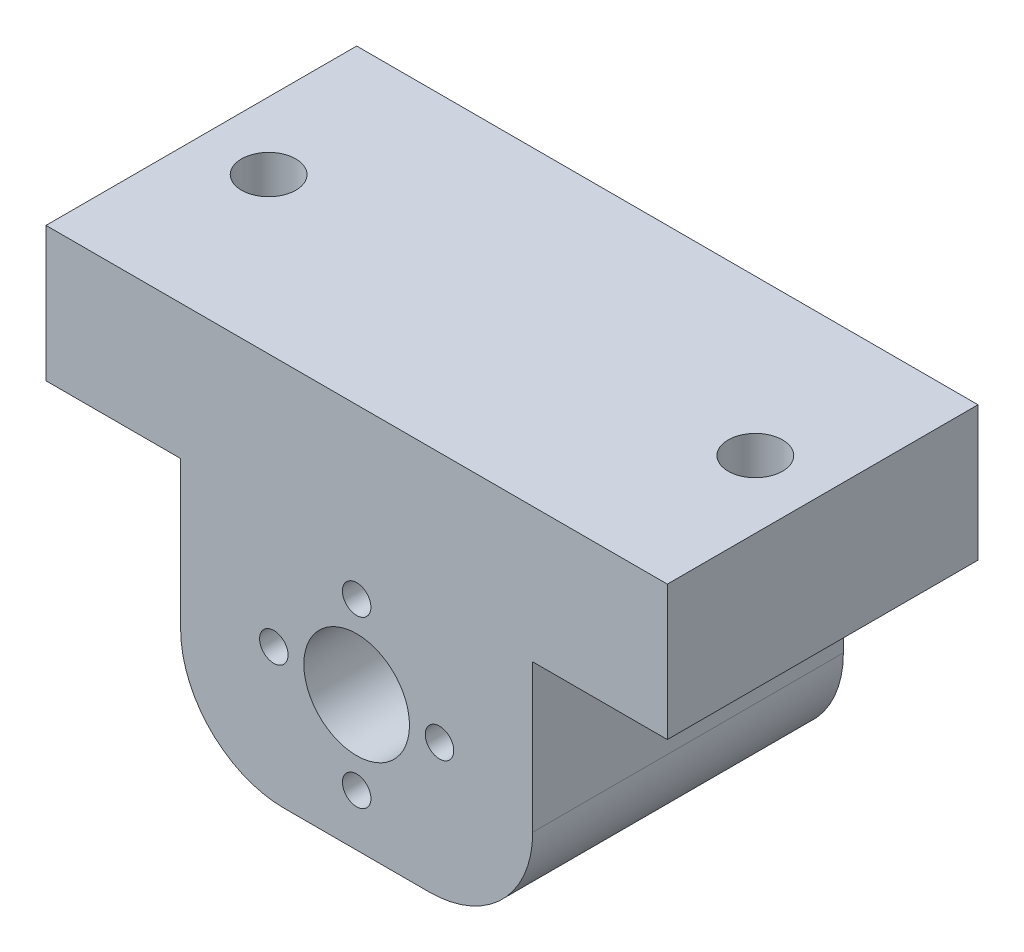
ISO-10303-21;
HEADER;
FILE_DESCRIPTION(('STEP AP214'),'2;1');
FILE_NAME('part.step','',(''),(''),'','','');
FILE_SCHEMA(('AUTOMOTIVE_DESIGN { 1 0 10303 214 1 1 1 1 }'));
ENDSEC;
DATA;
#1=APPLICATION_CONTEXT('core data for automotive mechanical design processes');
#2=APPLICATION_PROTOCOL_DEFINITION('international standard','automotive_design',2000,#1);
#3=PRODUCT_CONTEXT('',#1,'mechanical');
#4=PRODUCT('Part','Part','',(#3));
#5=PRODUCT_RELATED_PRODUCT_CATEGORY('part','',(#4));
#6=PRODUCT_DEFINITION_FORMATION('','',#4);
#7=PRODUCT_DEFINITION_CONTEXT('part definition',#1,'design');
#8=PRODUCT_DEFINITION('design','',#6,#7);
#9=PRODUCT_DEFINITION_SHAPE('','',#8);
#10=(LENGTH_UNIT() NAMED_UNIT(*) SI_UNIT(.MILLI.,.METRE.));
#11=(NAMED_UNIT(*) PLANE_ANGLE_UNIT() SI_UNIT($,.RADIAN.));
#12=(NAMED_UNIT(*) SI_UNIT($,.STERADIAN.) SOLID_ANGLE_UNIT());
#13=UNCERTAINTY_MEASURE_WITH_UNIT(LENGTH_MEASURE(1.E-05),#10,'distance_accuracy_value','');
#14=(GEOMETRIC_REPRESENTATION_CONTEXT(3) GLOBAL_UNCERTAINTY_ASSIGNED_CONTEXT((#13)) GLOBAL_UNIT_ASSIGNED_CONTEXT((#10,
#11,#12)) REPRESENTATION_CONTEXT('',''));
#15=CARTESIAN_POINT('',(0.,0.,0.));
#16=DIRECTION('',(0.,0.,1.));
#17=DIRECTION('',(1.,0.,0.));
#18=AXIS2_PLACEMENT_3D('',#15,#16,#17);
#19=CARTESIAN_POINT('',(0.,0.,30.));
#20=DIRECTION('',(0.,0.,-1.));
#21=DIRECTION('',(-1.,0.,0.));
#22=AXIS2_PLACEMENT_3D('',#19,#20,#21);
#23=CYLINDRICAL_SURFACE('',#22,5.1);
#24=CARTESIAN_POINT('',(0.,0.,30.));
#25=DIRECTION('',(0.,0.,1.));
#26=DIRECTION('',(1.,0.,0.));
#27=AXIS2_PLACEMENT_3D('',#24,#25,#26);
#28=CIRCLE('',#27,5.1);
#29=CARTESIAN_POINT('',(5.1,0.,30.));
#30=VERTEX_POINT('',#29);
#31=EDGE_CURVE('E149',#30,#30,#28,.T.);
#32=ORIENTED_EDGE('',*,*,#31,.T.);
#33=EDGE_LOOP('',(#32));
#34=FACE_BOUND('',#33,.T.);
#35=CARTESIAN_POINT('',(0.,0.,5.));
#36=DIRECTION('',(0.,0.,-1.));
#37=DIRECTION('',(-1.,0.,0.));
#38=AXIS2_PLACEMENT_3D('',#35,#36,#37);
#39=CIRCLE('',#38,5.1);
#40=CARTESIAN_POINT('',(-5.1,0.,5.));
#41=VERTEX_POINT('',#40);
#42=EDGE_CURVE('E226',#41,#41,#39,.T.);
#43=ORIENTED_EDGE('',*,*,#42,.T.);
#44=EDGE_LOOP('',(#43));
#45=FACE_BOUND('',#44,.T.);
#46=ADVANCED_FACE('F34',(#34,#45),#23,.F.);
#47=CARTESIAN_POINT('',(0.,8.,30.));
#48=DIRECTION('',(0.,0.,-1.));
#49=DIRECTION('',(-1.,0.,0.));
#50=AXIS2_PLACEMENT_3D('',#47,#48,#49);
#51=CYLINDRICAL_SURFACE('',#50,1.375);
#52=CARTESIAN_POINT('',(0.,8.,30.));
#53=DIRECTION('',(0.,0.,1.));
#54=DIRECTION('',(1.,0.,0.));
#55=AXIS2_PLACEMENT_3D('',#52,#53,#54);
#56=CIRCLE('',#55,1.375);
#57=CARTESIAN_POINT('',(1.375,8.,30.));
#58=VERTEX_POINT('',#57);
#59=EDGE_CURVE('E214',#58,#58,#56,.T.);
#60=ORIENTED_EDGE('',*,*,#59,.T.);
#61=EDGE_LOOP('',(#60));
#62=FACE_BOUND('',#61,.T.);
#63=CARTESIAN_POINT('',(0.,8.,5.));
#64=DIRECTION('',(0.,0.,-1.));
#65=DIRECTION('',(-1.,0.,0.));
#66=AXIS2_PLACEMENT_3D('',#63,#64,#65);
#67=CIRCLE('',#66,1.375);
#68=CARTESIAN_POINT('',(-1.375,8.,5.));
#69=VERTEX_POINT('',#68);
#70=EDGE_CURVE('E229',#69,#69,#67,.T.);
#71=ORIENTED_EDGE('',*,*,#70,.T.);
#72=EDGE_LOOP('',(#71));
#73=FACE_BOUND('',#72,.T.);
#74=ADVANCED_FACE('F277',(#62,#73),#51,.F.);
#75=CARTESIAN_POINT('',(8.,0.,30.));
#76=DIRECTION('',(0.,0.,-1.));
#77=DIRECTION('',(-1.,0.,0.));
#78=AXIS2_PLACEMENT_3D('',#75,#76,#77);
#79=CYLINDRICAL_SURFACE('',#78,1.375);
#80=CARTESIAN_POINT('',(8.,0.,30.));
#81=DIRECTION('',(0.,0.,1.));
#82=DIRECTION('',(1.,0.,0.));
#83=AXIS2_PLACEMENT_3D('',#80,#81,#82);
#84=CIRCLE('',#83,1.375);
#85=CARTESIAN_POINT('',(9.375,0.,30.));
#86=VERTEX_POINT('',#85);
#87=EDGE_CURVE('E217',#86,#86,#84,.T.);
#88=ORIENTED_EDGE('',*,*,#87,.T.);
#89=EDGE_LOOP('',(#88));
#90=FACE_BOUND('',#89,.T.);
#91=CARTESIAN_POINT('',(8.,0.,5.));
#92=DIRECTION('',(0.,0.,-1.));
#93=DIRECTION('',(-1.,0.,0.));
#94=AXIS2_PLACEMENT_3D('',#91,#92,#93);
#95=CIRCLE('',#94,1.375);
#96=CARTESIAN_POINT('',(6.625,0.,5.));
#97=VERTEX_POINT('',#96);
#98=EDGE_CURVE('E232',#97,#97,#95,.T.);
#99=ORIENTED_EDGE('',*,*,#98,.T.);
#100=EDGE_LOOP('',(#99));
#101=FACE_BOUND('',#100,.T.);
#102=ADVANCED_FACE('F283',(#90,#101),#79,.F.);
#103=CARTESIAN_POINT('',(0.,-8.,30.));
#104=DIRECTION('',(0.,0.,-1.));
#105=DIRECTION('',(-1.,0.,0.));
#106=AXIS2_PLACEMENT_3D('',#103,#104,#105);
#107=CYLINDRICAL_SURFACE('',#106,1.375);
#108=CARTESIAN_POINT('',(0.,-8.,30.));
#109=DIRECTION('',(0.,0.,1.));
#110=DIRECTION('',(1.,0.,0.));
#111=AXIS2_PLACEMENT_3D('',#108,#109,#110);
#112=CIRCLE('',#111,1.375);
#113=CARTESIAN_POINT('',(1.375,-8.,30.));
#114=VERTEX_POINT('',#113);
#115=EDGE_CURVE('E220',#114,#114,#112,.T.);
#116=ORIENTED_EDGE('',*,*,#115,.T.);
#117=EDGE_LOOP('',(#116));
#118=FACE_BOUND('',#117,.T.);
#119=CARTESIAN_POINT('',(0.,-8.,5.));
#120=DIRECTION('',(0.,0.,-1.));
#121=DIRECTION('',(-1.,0.,0.));
#122=AXIS2_PLACEMENT_3D('',#119,#120,#121);
#123=CIRCLE('',#122,1.375);
#124=CARTESIAN_POINT('',(-1.375,-8.,5.));
#125=VERTEX_POINT('',#124);
#126=EDGE_CURVE('E235',#125,#125,#123,.T.);
#127=ORIENTED_EDGE('',*,*,#126,.T.);
#128=EDGE_LOOP('',(#127));
#129=FACE_BOUND('',#128,.T.);
#130=ADVANCED_FACE('F340',(#118,#129),#107,.F.);
#131=CARTESIAN_POINT('',(-8.,0.,30.));
#132=DIRECTION('',(0.,0.,-1.));
#133=DIRECTION('',(-1.,0.,0.));
#134=AXIS2_PLACEMENT_3D('',#131,#132,#133);
#135=CYLINDRICAL_SURFACE('',#134,1.375);
#136=CARTESIAN_POINT('',(-8.,0.,30.));
#137=DIRECTION('',(0.,0.,1.));
#138=DIRECTION('',(1.,0.,0.));
#139=AXIS2_PLACEMENT_3D('',#136,#137,#138);
#140=CIRCLE('',#139,1.375);
#141=CARTESIAN_POINT('',(-6.625,0.,30.));
#142=VERTEX_POINT('',#141);
#143=EDGE_CURVE('E223',#142,#142,#140,.T.);
#144=ORIENTED_EDGE('',*,*,#143,.T.);
#145=EDGE_LOOP('',(#144));
#146=FACE_BOUND('',#145,.T.);
#147=CARTESIAN_POINT('',(-8.,0.,5.));
#148=DIRECTION('',(0.,0.,-1.));
#149=DIRECTION('',(-1.,0.,0.));
#150=AXIS2_PLACEMENT_3D('',#147,#148,#149);
#151=CIRCLE('',#150,1.375);
#152=CARTESIAN_POINT('',(-9.375,0.,5.));
#153=VERTEX_POINT('',#152);
#154=EDGE_CURVE('E38',#153,#153,#151,.T.);
#155=ORIENTED_EDGE('',*,*,#154,.T.);
#156=EDGE_LOOP('',(#155));
#157=FACE_BOUND('',#156,.T.);
#158=ADVANCED_FACE('F291',(#146,#157),#135,.F.);
#159=CARTESIAN_POINT('',(7.00000000000001,-3.,30.));
#160=DIRECTION('',(0.,0.,1.));
#161=DIRECTION('',(1.,0.,0.));
#162=AXIS2_PLACEMENT_3D('',#159,#160,#161);
#163=PLANE('',#162);
#164=ORIENTED_EDGE('',*,*,#115,.F.);
#165=EDGE_LOOP('',(#164));
#166=FACE_BOUND('',#165,.T.);
#167=ORIENTED_EDGE('',*,*,#59,.F.);
#168=EDGE_LOOP('',(#167));
#169=FACE_BOUND('',#168,.T.);
#170=DIRECTION('',(0.,1.,0.));
#171=VECTOR('',#170,1.);
#172=CARTESIAN_POINT('',(30.,24.25,30.));
#173=LINE('',#172,#171);
#174=CARTESIAN_POINT('',(30.,11.25,30.));
#175=VERTEX_POINT('',#174);
#176=CARTESIAN_POINT('',(30.,24.25,30.));
#177=VERTEX_POINT('',#176);
#178=EDGE_CURVE('E164',#175,#177,#173,.T.);
#179=ORIENTED_EDGE('',*,*,#178,.T.);
#180=DIRECTION('',(-1.,0.,0.));
#181=VECTOR('',#180,1.);
#182=CARTESIAN_POINT('',(-30.,24.25,30.));
#183=LINE('',#182,#181);
#184=CARTESIAN_POINT('',(-30.,24.25,30.));
#185=VERTEX_POINT('',#184);
#186=EDGE_CURVE('E101',#177,#185,#183,.T.);
#187=ORIENTED_EDGE('',*,*,#186,.T.);
#188=DIRECTION('',(0.,-1.,0.));
#189=VECTOR('',#188,1.);
#190=CARTESIAN_POINT('',(-30.,24.25,30.));
#191=LINE('',#190,#189);
#192=CARTESIAN_POINT('',(-30.,11.25,30.));
#193=VERTEX_POINT('',#192);
#194=EDGE_CURVE('E186',#185,#193,#191,.T.);
#195=ORIENTED_EDGE('',*,*,#194,.T.);
#196=DIRECTION('',(1.,0.,0.));
#197=VECTOR('',#196,1.);
#198=CARTESIAN_POINT('',(-30.,11.25,30.));
#199=LINE('',#198,#197);
#200=CARTESIAN_POINT('',(-17.,11.25,30.));
#201=VERTEX_POINT('',#200);
#202=EDGE_CURVE('E204',#193,#201,#199,.T.);
#203=ORIENTED_EDGE('',*,*,#202,.T.);
#204=DIRECTION('',(0.,-1.,0.));
#205=VECTOR('',#204,1.);
#206=CARTESIAN_POINT('',(-17.,11.25,30.));
#207=LINE('',#206,#205);
#208=CARTESIAN_POINT('',(-17.,-3.,30.));
#209=VERTEX_POINT('',#208);
#210=EDGE_CURVE('E201',#201,#209,#207,.T.);
#211=ORIENTED_EDGE('',*,*,#210,.T.);
#212=CARTESIAN_POINT('',(-7.,-3.,30.));
#213=DIRECTION('',(0.,0.,1.));
#214=DIRECTION('',(-1.,0.,0.));
#215=AXIS2_PLACEMENT_3D('',#212,#213,#214);
#216=CIRCLE('',#215,10.);
#217=CARTESIAN_POINT('',(-7.,-13.,30.));
#218=VERTEX_POINT('',#217);
#219=EDGE_CURVE('E203',#209,#218,#216,.T.);
#220=ORIENTED_EDGE('',*,*,#219,.T.);
#221=DIRECTION('',(1.,0.,0.));
#222=VECTOR('',#221,1.);
#223=CARTESIAN_POINT('',(7.00000000000001,-13.,30.));
#224=LINE('',#223,#222);
#225=CARTESIAN_POINT('',(7.00000000000001,-13.,30.));
#226=VERTEX_POINT('',#225);
#227=EDGE_CURVE('E127',#218,#226,#224,.T.);
#228=ORIENTED_EDGE('',*,*,#227,.T.);
#229=CARTESIAN_POINT('',(7.00000000000001,-3.,30.));
#230=DIRECTION('',(0.,0.,1.));
#231=DIRECTION('',(1.,0.,0.));
#232=AXIS2_PLACEMENT_3D('',#229,#230,#231);
#233=CIRCLE('',#232,10.);
#234=CARTESIAN_POINT('',(17.,-3.,30.));
#235=VERTEX_POINT('',#234);
#236=EDGE_CURVE('E120',#226,#235,#233,.T.);
#237=ORIENTED_EDGE('',*,*,#236,.T.);
#238=DIRECTION('',(0.,1.,0.));
#239=VECTOR('',#238,1.);
#240=CARTESIAN_POINT('',(17.,11.25,30.));
#241=LINE('',#240,#239);
#242=CARTESIAN_POINT('',(17.,11.25,30.));
#243=VERTEX_POINT('',#242);
#244=EDGE_CURVE('E125',#235,#243,#241,.T.);
#245=ORIENTED_EDGE('',*,*,#244,.T.);
#246=DIRECTION('',(1.,0.,0.));
#247=VECTOR('',#246,1.);
#248=CARTESIAN_POINT('',(30.,11.25,30.));
#249=LINE('',#248,#247);
#250=EDGE_CURVE('E52',#243,#175,#249,.T.);
#251=ORIENTED_EDGE('',*,*,#250,.T.);
#252=EDGE_LOOP('',(#179,#187,#195,#203,#211,#220,#228,#237,#245,#251));
#253=FACE_BOUND('',#252,.T.);
#254=ORIENTED_EDGE('',*,*,#31,.F.);
#255=EDGE_LOOP('',(#254));
#256=FACE_BOUND('',#255,.T.);
#257=ORIENTED_EDGE('',*,*,#87,.F.);
#258=EDGE_LOOP('',(#257));
#259=FACE_BOUND('',#258,.T.);
#260=ORIENTED_EDGE('',*,*,#143,.F.);
#261=EDGE_LOOP('',(#260));
#262=FACE_BOUND('',#261,.T.);
#263=ADVANCED_FACE('F122',(#166,#169,#253,#256,#259,#262),#163,.T.);
#264=CARTESIAN_POINT('',(7.00000000000001,-3.,0.));
#265=DIRECTION('',(0.,0.,1.));
#266=DIRECTION('',(1.,0.,0.));
#267=AXIS2_PLACEMENT_3D('',#264,#265,#266);
#268=PLANE('',#267);
#269=CARTESIAN_POINT('',(0.,0.,0.));
#270=DIRECTION('',(0.,0.,-1.));
#271=DIRECTION('',(-1.,0.,0.));
#272=AXIS2_PLACEMENT_3D('',#269,#270,#271);
#273=CIRCLE('',#272,11.75);
#274=CARTESIAN_POINT('',(-11.75,0.,0.));
#275=VERTEX_POINT('',#274);
#276=EDGE_CURVE('E238',#275,#275,#273,.T.);
#277=ORIENTED_EDGE('',*,*,#276,.F.);
#278=EDGE_LOOP('',(#277));
#279=FACE_BOUND('',#278,.T.);
#280=DIRECTION('',(0.,1.,0.));
#281=VECTOR('',#280,1.);
#282=CARTESIAN_POINT('',(30.,24.25,0.));
#283=LINE('',#282,#281);
#284=CARTESIAN_POINT('',(30.,11.25,0.));
#285=VERTEX_POINT('',#284);
#286=CARTESIAN_POINT('',(30.,24.25,0.));
#287=VERTEX_POINT('',#286);
#288=EDGE_CURVE('E145',#285,#287,#283,.T.);
#289=ORIENTED_EDGE('',*,*,#288,.F.);
#290=DIRECTION('',(1.,0.,0.));
#291=VECTOR('',#290,1.);
#292=CARTESIAN_POINT('',(30.,11.25,0.));
#293=LINE('',#292,#291);
#294=CARTESIAN_POINT('',(17.,11.25,0.));
#295=VERTEX_POINT('',#294);
#296=EDGE_CURVE('E93',#295,#285,#293,.T.);
#297=ORIENTED_EDGE('',*,*,#296,.F.);
#298=DIRECTION('',(0.,1.,0.));
#299=VECTOR('',#298,1.);
#300=CARTESIAN_POINT('',(17.,11.25,0.));
#301=LINE('',#300,#299);
#302=CARTESIAN_POINT('',(17.,-3.,0.));
#303=VERTEX_POINT('',#302);
#304=EDGE_CURVE('E87',#303,#295,#301,.T.);
#305=ORIENTED_EDGE('',*,*,#304,.F.);
#306=CARTESIAN_POINT('',(7.00000000000001,-3.,0.));
#307=DIRECTION('',(0.,0.,1.));
#308=DIRECTION('',(1.,0.,0.));
#309=AXIS2_PLACEMENT_3D('',#306,#307,#308);
#310=CIRCLE('',#309,10.);
#311=CARTESIAN_POINT('',(7.00000000000001,-13.,0.));
#312=VERTEX_POINT('',#311);
#313=EDGE_CURVE('E135',#312,#303,#310,.T.);
#314=ORIENTED_EDGE('',*,*,#313,.F.);
#315=DIRECTION('',(1.,0.,0.));
#316=VECTOR('',#315,1.);
#317=CARTESIAN_POINT('',(7.00000000000001,-13.,0.));
#318=LINE('',#317,#316);
#319=CARTESIAN_POINT('',(-7.,-13.,0.));
#320=VERTEX_POINT('',#319);
#321=EDGE_CURVE('E159',#320,#312,#318,.T.);
#322=ORIENTED_EDGE('',*,*,#321,.F.);
#323=CARTESIAN_POINT('',(-7.,-3.,0.));
#324=DIRECTION('',(0.,0.,1.));
#325=DIRECTION('',(-1.,0.,0.));
#326=AXIS2_PLACEMENT_3D('',#323,#324,#325);
#327=CIRCLE('',#326,10.);
#328=CARTESIAN_POINT('',(-17.,-3.,0.));
#329=VERTEX_POINT('',#328);
#330=EDGE_CURVE('E157',#329,#320,#327,.T.);
#331=ORIENTED_EDGE('',*,*,#330,.F.);
#332=DIRECTION('',(0.,-1.,0.));
#333=VECTOR('',#332,1.);
#334=CARTESIAN_POINT('',(-17.,11.25,0.));
#335=LINE('',#334,#333);
#336=CARTESIAN_POINT('',(-17.,11.25,0.));
#337=VERTEX_POINT('',#336);
#338=EDGE_CURVE('E155',#337,#329,#335,.T.);
#339=ORIENTED_EDGE('',*,*,#338,.F.);
#340=DIRECTION('',(1.,0.,0.));
#341=VECTOR('',#340,1.);
#342=CARTESIAN_POINT('',(-30.,11.25,0.));
#343=LINE('',#342,#341);
#344=CARTESIAN_POINT('',(-30.,11.25,0.));
#345=VERTEX_POINT('',#344);
#346=EDGE_CURVE('E153',#345,#337,#343,.T.);
#347=ORIENTED_EDGE('',*,*,#346,.F.);
#348=DIRECTION('',(0.,-1.,0.));
#349=VECTOR('',#348,1.);
#350=CARTESIAN_POINT('',(-30.,24.25,0.));
#351=LINE('',#350,#349);
#352=CARTESIAN_POINT('',(-30.,24.25,0.));
#353=VERTEX_POINT('',#352);
#354=EDGE_CURVE('E151',#353,#345,#351,.T.);
#355=ORIENTED_EDGE('',*,*,#354,.F.);
#356=DIRECTION('',(-1.,0.,0.));
#357=VECTOR('',#356,1.);
#358=CARTESIAN_POINT('',(-30.,24.25,0.));
#359=LINE('',#358,#357);
#360=EDGE_CURVE('E148',#287,#353,#359,.T.);
#361=ORIENTED_EDGE('',*,*,#360,.F.);
#362=EDGE_LOOP('',(#289,#297,#305,#314,#322,#331,#339,#347,#355,#361));
#363=FACE_BOUND('',#362,.T.);
#364=ADVANCED_FACE('F190',(#279,#363),#268,.F.);
#365=CARTESIAN_POINT('',(30.,24.25,30.));
#366=DIRECTION('',(-1.,0.,0.));
#367=DIRECTION('',(0.,-1.,0.));
#368=AXIS2_PLACEMENT_3D('',#365,#366,#367);
#369=PLANE('',#368);
#370=ORIENTED_EDGE('',*,*,#288,.T.);
#371=DIRECTION('',(0.,0.,-1.));
#372=VECTOR('',#371,1.);
#373=CARTESIAN_POINT('',(30.,24.25,30.));
#374=LINE('',#373,#372);
#375=EDGE_CURVE('E11',#177,#287,#374,.T.);
#376=ORIENTED_EDGE('',*,*,#375,.F.);
#377=ORIENTED_EDGE('',*,*,#178,.F.);
#378=DIRECTION('',(0.,0.,-1.));
#379=VECTOR('',#378,1.);
#380=CARTESIAN_POINT('',(30.,11.25,30.));
#381=LINE('',#380,#379);
#382=EDGE_CURVE('E141',#175,#285,#381,.T.);
#383=ORIENTED_EDGE('',*,*,#382,.T.);
#384=EDGE_LOOP('',(#370,#376,#377,#383));
#385=FACE_BOUND('',#384,.T.);
#386=ADVANCED_FACE('F36',(#385),#369,.F.);
#387=CARTESIAN_POINT('',(-30.,24.25,30.));
#388=DIRECTION('',(0.,-1.,0.));
#389=DIRECTION('',(1.,0.,0.));
#390=AXIS2_PLACEMENT_3D('',#387,#388,#389);
#391=PLANE('',#390);
#392=CARTESIAN_POINT('',(-23.5,24.25,15.));
#393=DIRECTION('',(0.,-1.,0.));
#394=DIRECTION('',(0.,0.,-1.));
#395=AXIS2_PLACEMENT_3D('',#392,#393,#394);
#396=CIRCLE('',#395,2.625);
#397=CARTESIAN_POINT('',(-23.5,24.25,12.375));
#398=VERTEX_POINT('',#397);
#399=EDGE_CURVE('E242',#398,#398,#396,.T.);
#400=ORIENTED_EDGE('',*,*,#399,.T.);
#401=EDGE_LOOP('',(#400));
#402=FACE_BOUND('',#401,.T.);
#403=CARTESIAN_POINT('',(23.5,24.25,15.));
#404=DIRECTION('',(0.,-1.,0.));
#405=DIRECTION('',(0.,0.,-1.));
#406=AXIS2_PLACEMENT_3D('',#403,#404,#405);
#407=CIRCLE('',#406,2.625);
#408=CARTESIAN_POINT('',(23.5,24.25,12.375));
#409=VERTEX_POINT('',#408);
#410=EDGE_CURVE('E248',#409,#409,#407,.T.);
#411=ORIENTED_EDGE('',*,*,#410,.T.);
#412=EDGE_LOOP('',(#411));
#413=FACE_BOUND('',#412,.T.);
#414=ORIENTED_EDGE('',*,*,#360,.T.);
#415=DIRECTION('',(0.,0.,-1.));
#416=VECTOR('',#415,1.);
#417=CARTESIAN_POINT('',(-30.,24.25,30.));
#418=LINE('',#417,#416);
#419=EDGE_CURVE('E44',#185,#353,#418,.T.);
#420=ORIENTED_EDGE('',*,*,#419,.F.);
#421=ORIENTED_EDGE('',*,*,#186,.F.);
#422=ORIENTED_EDGE('',*,*,#375,.T.);
#423=EDGE_LOOP('',(#414,#420,#421,#422));
#424=FACE_BOUND('',#423,.T.);
#425=ADVANCED_FACE('F257',(#402,#413,#424),#391,.F.);
#426=CARTESIAN_POINT('',(-30.,24.25,30.));
#427=DIRECTION('',(1.,0.,0.));
#428=DIRECTION('',(0.,1.,0.));
#429=AXIS2_PLACEMENT_3D('',#426,#427,#428);
#430=PLANE('',#429);
#431=ORIENTED_EDGE('',*,*,#354,.T.);
#432=DIRECTION('',(0.,0.,-1.));
#433=VECTOR('',#432,1.);
#434=CARTESIAN_POINT('',(-30.,11.25,30.));
#435=LINE('',#434,#433);
#436=EDGE_CURVE('E177',#193,#345,#435,.T.);
#437=ORIENTED_EDGE('',*,*,#436,.F.);
#438=ORIENTED_EDGE('',*,*,#194,.F.);
#439=ORIENTED_EDGE('',*,*,#419,.T.);
#440=EDGE_LOOP('',(#431,#437,#438,#439));
#441=FACE_BOUND('',#440,.T.);
#442=ADVANCED_FACE('F184',(#441),#430,.F.);
#443=CARTESIAN_POINT('',(-30.,11.25,30.));
#444=DIRECTION('',(0.,1.,0.));
#445=DIRECTION('',(0.,0.,1.));
#446=AXIS2_PLACEMENT_3D('',#443,#444,#445);
#447=PLANE('',#446);
#448=CARTESIAN_POINT('',(-23.5,11.25,15.));
#449=DIRECTION('',(0.,-1.,0.));
#450=DIRECTION('',(0.,0.,-1.));
#451=AXIS2_PLACEMENT_3D('',#448,#449,#450);
#452=CIRCLE('',#451,2.625);
#453=CARTESIAN_POINT('',(-23.5,11.25,12.375));
#454=VERTEX_POINT('',#453);
#455=EDGE_CURVE('E251',#454,#454,#452,.T.);
#456=ORIENTED_EDGE('',*,*,#455,.F.);
#457=EDGE_LOOP('',(#456));
#458=FACE_BOUND('',#457,.T.);
#459=ORIENTED_EDGE('',*,*,#346,.T.);
#460=DIRECTION('',(0.,0.,-1.));
#461=VECTOR('',#460,1.);
#462=CARTESIAN_POINT('',(-17.,11.25,30.));
#463=LINE('',#462,#461);
#464=EDGE_CURVE('E174',#201,#337,#463,.T.);
#465=ORIENTED_EDGE('',*,*,#464,.F.);
#466=ORIENTED_EDGE('',*,*,#202,.F.);
#467=ORIENTED_EDGE('',*,*,#436,.T.);
#468=EDGE_LOOP('',(#459,#465,#466,#467));
#469=FACE_BOUND('',#468,.T.);
#470=ADVANCED_FACE('F195',(#458,#469),#447,.F.);
#471=CARTESIAN_POINT('',(-17.,11.25,30.));
#472=DIRECTION('',(1.,0.,0.));
#473=DIRECTION('',(0.,0.,-1.));
#474=AXIS2_PLACEMENT_3D('',#471,#472,#473);
#475=PLANE('',#474);
#476=ORIENTED_EDGE('',*,*,#338,.T.);
#477=DIRECTION('',(0.,0.,-1.));
#478=VECTOR('',#477,1.);
#479=CARTESIAN_POINT('',(-17.,-3.,30.));
#480=LINE('',#479,#478);
#481=EDGE_CURVE('E171',#209,#329,#480,.T.);
#482=ORIENTED_EDGE('',*,*,#481,.F.);
#483=ORIENTED_EDGE('',*,*,#210,.F.);
#484=ORIENTED_EDGE('',*,*,#464,.T.);
#485=EDGE_LOOP('',(#476,#482,#483,#484));
#486=FACE_BOUND('',#485,.T.);
#487=ADVANCED_FACE('F199',(#486),#475,.F.);
#488=CARTESIAN_POINT('',(-7.,-3.,30.));
#489=DIRECTION('',(0.,0.,-1.));
#490=DIRECTION('',(-1.,0.,0.));
#491=AXIS2_PLACEMENT_3D('',#488,#489,#490);
#492=CYLINDRICAL_SURFACE('',#491,10.);
#493=ORIENTED_EDGE('',*,*,#330,.T.);
#494=DIRECTION('',(0.,0.,-1.));
#495=VECTOR('',#494,1.);
#496=CARTESIAN_POINT('',(-7.,-13.,30.));
#497=LINE('',#496,#495);
#498=EDGE_CURVE('E168',#218,#320,#497,.T.);
#499=ORIENTED_EDGE('',*,*,#498,.F.);
#500=ORIENTED_EDGE('',*,*,#219,.F.);
#501=ORIENTED_EDGE('',*,*,#481,.T.);
#502=EDGE_LOOP('',(#493,#499,#500,#501));
#503=FACE_BOUND('',#502,.T.);
#504=ADVANCED_FACE('F273',(#503),#492,.T.);
#505=CARTESIAN_POINT('',(7.00000000000001,-13.,30.));
#506=DIRECTION('',(0.,1.,0.));
#507=DIRECTION('',(-1.,0.,0.));
#508=AXIS2_PLACEMENT_3D('',#505,#506,#507);
#509=PLANE('',#508);
#510=ORIENTED_EDGE('',*,*,#321,.T.);
#511=DIRECTION('',(0.,0.,-1.));
#512=VECTOR('',#511,1.);
#513=CARTESIAN_POINT('',(7.00000000000001,-13.,30.));
#514=LINE('',#513,#512);
#515=EDGE_CURVE('E136',#226,#312,#514,.T.);
#516=ORIENTED_EDGE('',*,*,#515,.F.);
#517=ORIENTED_EDGE('',*,*,#227,.F.);
#518=ORIENTED_EDGE('',*,*,#498,.T.);
#519=EDGE_LOOP('',(#510,#516,#517,#518));
#520=FACE_BOUND('',#519,.T.);
#521=ADVANCED_FACE('F305',(#520),#509,.F.);
#522=CARTESIAN_POINT('',(7.00000000000001,-3.,30.));
#523=DIRECTION('',(0.,0.,-1.));
#524=DIRECTION('',(-1.,0.,0.));
#525=AXIS2_PLACEMENT_3D('',#522,#523,#524);
#526=CYLINDRICAL_SURFACE('',#525,10.);
#527=ORIENTED_EDGE('',*,*,#313,.T.);
#528=DIRECTION('',(0.,0.,-1.));
#529=VECTOR('',#528,1.);
#530=CARTESIAN_POINT('',(17.,-3.,30.));
#531=LINE('',#530,#529);
#532=EDGE_CURVE('E132',#235,#303,#531,.T.);
#533=ORIENTED_EDGE('',*,*,#532,.F.);
#534=ORIENTED_EDGE('',*,*,#236,.F.);
#535=ORIENTED_EDGE('',*,*,#515,.T.);
#536=EDGE_LOOP('',(#527,#533,#534,#535));
#537=FACE_BOUND('',#536,.T.);
#538=ADVANCED_FACE('F133',(#537),#526,.T.);
#539=CARTESIAN_POINT('',(17.,11.25,30.));
#540=DIRECTION('',(-1.,0.,0.));
#541=DIRECTION('',(0.,-1.,0.));
#542=AXIS2_PLACEMENT_3D('',#539,#540,#541);
#543=PLANE('',#542);
#544=ORIENTED_EDGE('',*,*,#304,.T.);
#545=DIRECTION('',(0.,0.,-1.));
#546=VECTOR('',#545,1.);
#547=CARTESIAN_POINT('',(17.,11.25,30.));
#548=LINE('',#547,#546);
#549=EDGE_CURVE('E137',#243,#295,#548,.T.);
#550=ORIENTED_EDGE('',*,*,#549,.F.);
#551=ORIENTED_EDGE('',*,*,#244,.F.);
#552=ORIENTED_EDGE('',*,*,#532,.T.);
#553=EDGE_LOOP('',(#544,#550,#551,#552));
#554=FACE_BOUND('',#553,.T.);
#555=ADVANCED_FACE('F139',(#554),#543,.F.);
#556=CARTESIAN_POINT('',(30.,11.25,30.));
#557=DIRECTION('',(0.,1.,0.));
#558=DIRECTION('',(-1.,0.,0.));
#559=AXIS2_PLACEMENT_3D('',#556,#557,#558);
#560=PLANE('',#559);
#561=CARTESIAN_POINT('',(23.5,11.25,15.));
#562=DIRECTION('',(0.,-1.,0.));
#563=DIRECTION('',(0.,0.,-1.));
#564=AXIS2_PLACEMENT_3D('',#561,#562,#563);
#565=CIRCLE('',#564,2.625);
#566=CARTESIAN_POINT('',(23.5,11.25,12.375));
#567=VERTEX_POINT('',#566);
#568=EDGE_CURVE('E245',#567,#567,#565,.T.);
#569=ORIENTED_EDGE('',*,*,#568,.F.);
#570=EDGE_LOOP('',(#569));
#571=FACE_BOUND('',#570,.T.);
#572=ORIENTED_EDGE('',*,*,#296,.T.);
#573=ORIENTED_EDGE('',*,*,#382,.F.);
#574=ORIENTED_EDGE('',*,*,#250,.F.);
#575=ORIENTED_EDGE('',*,*,#549,.T.);
#576=EDGE_LOOP('',(#572,#573,#574,#575));
#577=FACE_BOUND('',#576,.T.);
#578=ADVANCED_FACE('F296',(#571,#577),#560,.F.);
#579=CARTESIAN_POINT('',(0.,0.,5.));
#580=DIRECTION('',(0.,0.,-1.));
#581=DIRECTION('',(-1.,0.,0.));
#582=AXIS2_PLACEMENT_3D('',#579,#580,#581);
#583=CYLINDRICAL_SURFACE('',#582,11.75);
#584=CARTESIAN_POINT('',(0.,0.,5.));
#585=DIRECTION('',(0.,0.,-1.));
#586=DIRECTION('',(-1.,0.,0.));
#587=AXIS2_PLACEMENT_3D('',#584,#585,#586);
#588=CIRCLE('',#587,11.75);
#589=CARTESIAN_POINT('',(-11.75,0.,5.));
#590=VERTEX_POINT('',#589);
#591=EDGE_CURVE('E241',#590,#590,#588,.T.);
#592=ORIENTED_EDGE('',*,*,#591,.F.);
#593=EDGE_LOOP('',(#592));
#594=FACE_BOUND('',#593,.T.);
#595=ORIENTED_EDGE('',*,*,#276,.T.);
#596=EDGE_LOOP('',(#595));
#597=FACE_BOUND('',#596,.T.);
#598=ADVANCED_FACE('F299',(#594,#597),#583,.F.);
#599=CARTESIAN_POINT('',(0.,0.,5.));
#600=DIRECTION('',(0.,0.,-1.));
#601=DIRECTION('',(-1.,0.,0.));
#602=AXIS2_PLACEMENT_3D('',#599,#600,#601);
#603=PLANE('',#602);
#604=ORIENTED_EDGE('',*,*,#42,.F.);
#605=EDGE_LOOP('',(#604));
#606=FACE_BOUND('',#605,.T.);
#607=ORIENTED_EDGE('',*,*,#70,.F.);
#608=EDGE_LOOP('',(#607));
#609=FACE_BOUND('',#608,.T.);
#610=ORIENTED_EDGE('',*,*,#98,.F.);
#611=EDGE_LOOP('',(#610));
#612=FACE_BOUND('',#611,.T.);
#613=ORIENTED_EDGE('',*,*,#126,.F.);
#614=EDGE_LOOP('',(#613));
#615=FACE_BOUND('',#614,.T.);
#616=ORIENTED_EDGE('',*,*,#154,.F.);
#617=EDGE_LOOP('',(#616));
#618=FACE_BOUND('',#617,.T.);
#619=ORIENTED_EDGE('',*,*,#591,.T.);
#620=EDGE_LOOP('',(#619));
#621=FACE_BOUND('',#620,.T.);
#622=ADVANCED_FACE('F422',(#606,#609,#612,#615,#618,#621),#603,.T.);
#623=CARTESIAN_POINT('',(23.5,24.25,15.));
#624=DIRECTION('',(0.,-1.,0.));
#625=DIRECTION('',(0.,0.,-1.));
#626=AXIS2_PLACEMENT_3D('',#623,#624,#625);
#627=CYLINDRICAL_SURFACE('',#626,2.625);
#628=ORIENTED_EDGE('',*,*,#410,.F.);
#629=EDGE_LOOP('',(#628));
#630=FACE_BOUND('',#629,.T.);
#631=ORIENTED_EDGE('',*,*,#568,.T.);
#632=EDGE_LOOP('',(#631));
#633=FACE_BOUND('',#632,.T.);
#634=ADVANCED_FACE('F263',(#630,#633),#627,.F.);
#635=CARTESIAN_POINT('',(-23.5,24.25,15.));
#636=DIRECTION('',(0.,-1.,0.));
#637=DIRECTION('',(0.,0.,-1.));
#638=AXIS2_PLACEMENT_3D('',#635,#636,#637);
#639=CYLINDRICAL_SURFACE('',#638,2.625);
#640=ORIENTED_EDGE('',*,*,#399,.F.);
#641=EDGE_LOOP('',(#640));
#642=FACE_BOUND('',#641,.T.);
#643=ORIENTED_EDGE('',*,*,#455,.T.);
#644=EDGE_LOOP('',(#643));
#645=FACE_BOUND('',#644,.T.);
#646=ADVANCED_FACE('F260',(#642,#645),#639,.F.);
#647=CLOSED_SHELL('',(#46,#74,#102,#130,#158,#263,#364,#386,#425,#442,#470,#487,#504,#521,#538,
#555,#578,#598,#622,#634,#646));
#648=MANIFOLD_SOLID_BREP('B2',#647);
#649=ADVANCED_BREP_SHAPE_REPRESENTATION('',(#18,#648),#14);
#650=SHAPE_DEFINITION_REPRESENTATION(#9,#649);
ENDSEC;
END-ISO-10303-21;
